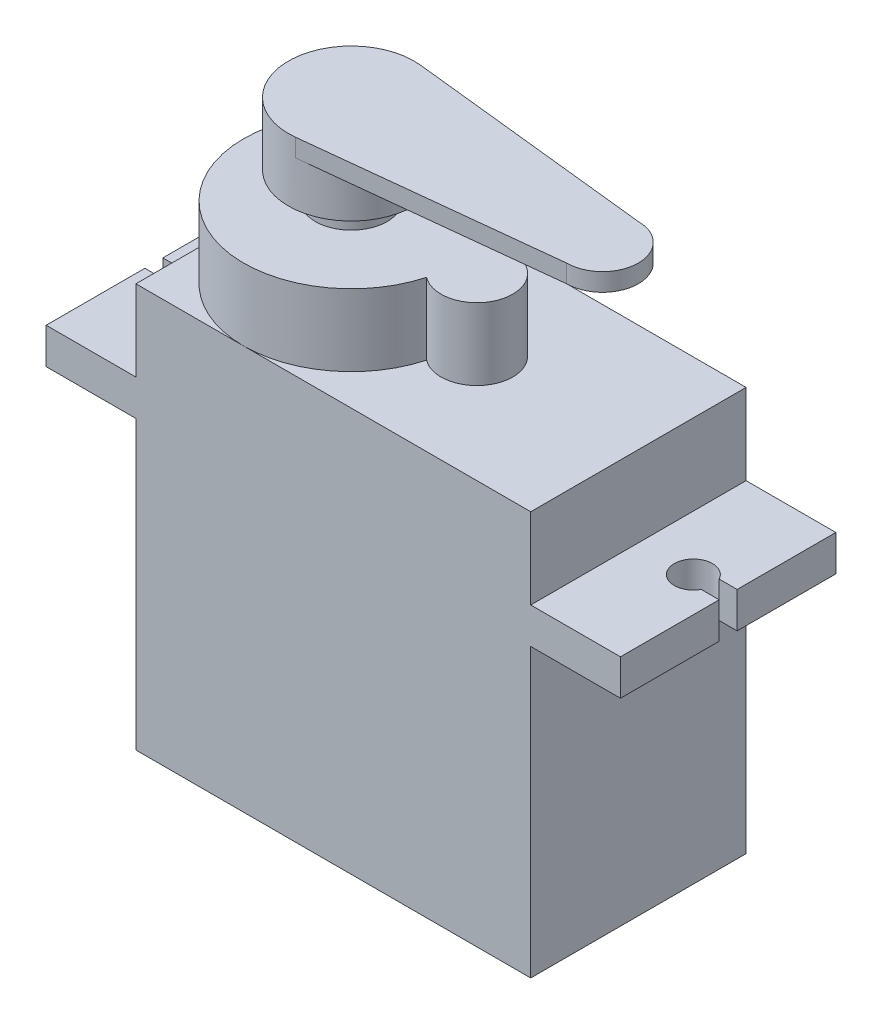
ISO-10303-21;
HEADER;
FILE_DESCRIPTION(('STEP AP214'),'2;1');
FILE_NAME('part.step','',(''),(''),'','','');
FILE_SCHEMA(('AUTOMOTIVE_DESIGN { 1 0 10303 214 1 1 1 1 }'));
ENDSEC;
DATA;
#1=APPLICATION_CONTEXT('core data for automotive mechanical design processes');
#2=APPLICATION_PROTOCOL_DEFINITION('international standard','automotive_design',2000,#1);
#3=PRODUCT_CONTEXT('',#1,'mechanical');
#4=PRODUCT('Part','Part','',(#3));
#5=PRODUCT_RELATED_PRODUCT_CATEGORY('part','',(#4));
#6=PRODUCT_DEFINITION_FORMATION('','',#4);
#7=PRODUCT_DEFINITION_CONTEXT('part definition',#1,'design');
#8=PRODUCT_DEFINITION('design','',#6,#7);
#9=PRODUCT_DEFINITION_SHAPE('','',#8);
#10=(LENGTH_UNIT() NAMED_UNIT(*) SI_UNIT(.MILLI.,.METRE.));
#11=(NAMED_UNIT(*) PLANE_ANGLE_UNIT() SI_UNIT($,.RADIAN.));
#12=(NAMED_UNIT(*) SI_UNIT($,.STERADIAN.) SOLID_ANGLE_UNIT());
#13=UNCERTAINTY_MEASURE_WITH_UNIT(LENGTH_MEASURE(1.E-05),#10,'distance_accuracy_value','');
#14=(GEOMETRIC_REPRESENTATION_CONTEXT(3) GLOBAL_UNCERTAINTY_ASSIGNED_CONTEXT((#13)) GLOBAL_UNIT_ASSIGNED_CONTEXT((#10,
#11,#12)) REPRESENTATION_CONTEXT('',''));
#15=CARTESIAN_POINT('',(0.,0.,0.));
#16=DIRECTION('',(0.,0.,1.));
#17=DIRECTION('',(1.,0.,0.));
#18=AXIS2_PLACEMENT_3D('',#15,#16,#17);
#19=CARTESIAN_POINT('',(-5.,26.5,0.));
#20=DIRECTION('',(0.,-1.,0.));
#21=DIRECTION('',(0.,0.,-1.));
#22=AXIS2_PLACEMENT_3D('',#19,#20,#21);
#23=CYLINDRICAL_SURFACE('',#22,6.);
#24=DIRECTION('',(0.,-1.,0.));
#25=VECTOR('',#24,1.);
#26=CARTESIAN_POINT('',(0.785714285714286,24.5,1.58918539009193));
#27=LINE('',#26,#25);
#28=CARTESIAN_POINT('',(0.785714285714286,26.5,1.58918539009193));
#29=VERTEX_POINT('',#28);
#30=CARTESIAN_POINT('',(0.785714285714285,22.5,1.58918539009193));
#31=VERTEX_POINT('',#30);
#32=EDGE_CURVE('E261',#29,#31,#27,.T.);
#33=ORIENTED_EDGE('',*,*,#32,.F.);
#34=CARTESIAN_POINT('',(-5.,26.5,0.));
#35=DIRECTION('',(0.,1.,0.));
#36=DIRECTION('',(0.,0.,1.));
#37=AXIS2_PLACEMENT_3D('',#34,#35,#36);
#38=CIRCLE('',#37,6.);
#39=CARTESIAN_POINT('',(0.785714285714285,26.5,-1.58918539009193));
#40=VERTEX_POINT('',#39);
#41=EDGE_CURVE('E264',#40,#29,#38,.T.);
#42=ORIENTED_EDGE('',*,*,#41,.F.);
#43=DIRECTION('',(0.,-1.,0.));
#44=VECTOR('',#43,1.);
#45=CARTESIAN_POINT('',(0.785714285714286,24.5,-1.58918539009193));
#46=LINE('',#45,#44);
#47=CARTESIAN_POINT('',(0.785714285714285,22.5,-1.58918539009193));
#48=VERTEX_POINT('',#47);
#49=EDGE_CURVE('E258',#48,#40,#46,.F.);
#50=ORIENTED_EDGE('',*,*,#49,.F.);
#51=CARTESIAN_POINT('',(-5.,22.5,0.));
#52=DIRECTION('',(0.,1.,0.));
#53=DIRECTION('',(0.,0.,1.));
#54=AXIS2_PLACEMENT_3D('',#51,#52,#53);
#55=CIRCLE('',#54,6.);
#56=CARTESIAN_POINT('',(-5.,22.5,-6.));
#57=VERTEX_POINT('',#56);
#58=EDGE_CURVE('E263',#48,#57,#55,.T.);
#59=ORIENTED_EDGE('',*,*,#58,.T.);
#60=CARTESIAN_POINT('',(-11.,22.5,0.));
#61=VERTEX_POINT('',#60);
#62=EDGE_CURVE('E256',#57,#61,#55,.T.);
#63=ORIENTED_EDGE('',*,*,#62,.T.);
#64=CARTESIAN_POINT('',(-5.,22.5,6.));
#65=VERTEX_POINT('',#64);
#66=EDGE_CURVE('E270',#61,#65,#55,.T.);
#67=ORIENTED_EDGE('',*,*,#66,.T.);
#68=EDGE_CURVE('E267',#65,#31,#55,.T.);
#69=ORIENTED_EDGE('',*,*,#68,.T.);
#70=EDGE_LOOP('',(#33,#42,#50,#59,#63,#67,#69));
#71=FACE_BOUND('',#70,.T.);
#72=ADVANCED_FACE('F34',(#71),#23,.T.);
#73=CARTESIAN_POINT('',(0.,22.5,0.));
#74=DIRECTION('',(0.,1.,0.));
#75=DIRECTION('',(0.,0.,1.));
#76=AXIS2_PLACEMENT_3D('',#73,#74,#75);
#77=PLANE('',#76);
#78=ORIENTED_EDGE('',*,*,#58,.F.);
#79=CARTESIAN_POINT('',(2.,22.5,0.));
#80=DIRECTION('',(0.,1.,0.));
#81=DIRECTION('',(0.,0.,1.));
#82=AXIS2_PLACEMENT_3D('',#79,#80,#81);
#83=CIRCLE('',#82,2.);
#84=EDGE_CURVE('E253',#31,#48,#83,.T.);
#85=ORIENTED_EDGE('',*,*,#84,.F.);
#86=ORIENTED_EDGE('',*,*,#68,.F.);
#87=DIRECTION('',(1.,0.,0.));
#88=VECTOR('',#87,1.);
#89=CARTESIAN_POINT('',(-11.,22.5,6.));
#90=LINE('',#89,#88);
#91=CARTESIAN_POINT('',(11.,22.5,6.));
#92=VERTEX_POINT('',#91);
#93=EDGE_CURVE('E393',#65,#92,#90,.T.);
#94=ORIENTED_EDGE('',*,*,#93,.T.);
#95=DIRECTION('',(0.,0.,-1.));
#96=VECTOR('',#95,1.);
#97=CARTESIAN_POINT('',(11.,22.5,-6.));
#98=LINE('',#97,#96);
#99=CARTESIAN_POINT('',(11.,22.5,-6.));
#100=VERTEX_POINT('',#99);
#101=EDGE_CURVE('E381',#92,#100,#98,.T.);
#102=ORIENTED_EDGE('',*,*,#101,.T.);
#103=DIRECTION('',(-1.,0.,0.));
#104=VECTOR('',#103,1.);
#105=CARTESIAN_POINT('',(-11.,22.5,-6.));
#106=LINE('',#105,#104);
#107=EDGE_CURVE('E386',#100,#57,#106,.T.);
#108=ORIENTED_EDGE('',*,*,#107,.T.);
#109=EDGE_LOOP('',(#78,#85,#86,#94,#102,#108));
#110=FACE_BOUND('',#109,.T.);
#111=ADVANCED_FACE('F483',(#110),#77,.T.);
#112=ORIENTED_EDGE('',*,*,#62,.F.);
#113=CARTESIAN_POINT('',(-11.,22.5,-6.));
#114=VERTEX_POINT('',#113);
#115=EDGE_CURVE('E384',#57,#114,#106,.T.);
#116=ORIENTED_EDGE('',*,*,#115,.T.);
#117=DIRECTION('',(0.,0.,1.));
#118=VECTOR('',#117,1.);
#119=CARTESIAN_POINT('',(-11.,22.5,-6.));
#120=LINE('',#119,#118);
#121=EDGE_CURVE('E390',#114,#61,#120,.T.);
#122=ORIENTED_EDGE('',*,*,#121,.T.);
#123=EDGE_LOOP('',(#112,#116,#122));
#124=FACE_BOUND('',#123,.T.);
#125=ADVANCED_FACE('F475',(#124),#77,.T.);
#126=CARTESIAN_POINT('',(16.,16.,6.));
#127=DIRECTION('',(0.,-1.,0.));
#128=DIRECTION('',(0.,0.,-1.));
#129=AXIS2_PLACEMENT_3D('',#126,#127,#128);
#130=PLANE('',#129);
#131=DIRECTION('',(0.,0.,1.));
#132=VECTOR('',#131,1.);
#133=CARTESIAN_POINT('',(16.,16.,6.));
#134=LINE('',#133,#132);
#135=CARTESIAN_POINT('',(16.,16.,-6.));
#136=VERTEX_POINT('',#135);
#137=CARTESIAN_POINT('',(16.,16.,-0.5));
#138=VERTEX_POINT('',#137);
#139=EDGE_CURVE('E302',#136,#138,#134,.T.);
#140=ORIENTED_EDGE('',*,*,#139,.T.);
#141=DIRECTION('',(1.,0.,0.));
#142=VECTOR('',#141,1.);
#143=CARTESIAN_POINT('',(16.,16.,-0.5));
#144=LINE('',#143,#142);
#145=CARTESIAN_POINT('',(15.,16.,-0.5));
#146=VERTEX_POINT('',#145);
#147=EDGE_CURVE('E273',#146,#138,#144,.T.);
#148=ORIENTED_EDGE('',*,*,#147,.F.);
#149=CARTESIAN_POINT('',(14.0625,16.,0.));
#150=DIRECTION('',(0.,-1.,0.));
#151=DIRECTION('',(0.,0.,-1.));
#152=AXIS2_PLACEMENT_3D('',#149,#150,#151);
#153=CIRCLE('',#152,1.0625);
#154=CARTESIAN_POINT('',(15.,16.,0.5));
#155=VERTEX_POINT('',#154);
#156=EDGE_CURVE('E266',#155,#146,#153,.T.);
#157=ORIENTED_EDGE('',*,*,#156,.F.);
#158=DIRECTION('',(-1.,0.,0.));
#159=VECTOR('',#158,1.);
#160=CARTESIAN_POINT('',(16.,16.,0.5));
#161=LINE('',#160,#159);
#162=CARTESIAN_POINT('',(16.,16.,0.5));
#163=VERTEX_POINT('',#162);
#164=EDGE_CURVE('E287',#163,#155,#161,.T.);
#165=ORIENTED_EDGE('',*,*,#164,.F.);
#166=CARTESIAN_POINT('',(16.,16.,6.));
#167=VERTEX_POINT('',#166);
#168=EDGE_CURVE('E300',#163,#167,#134,.T.);
#169=ORIENTED_EDGE('',*,*,#168,.T.);
#170=DIRECTION('',(-1.,0.,0.));
#171=VECTOR('',#170,1.);
#172=CARTESIAN_POINT('',(16.,16.,6.));
#173=LINE('',#172,#171);
#174=CARTESIAN_POINT('',(11.,16.,6.));
#175=VERTEX_POINT('',#174);
#176=EDGE_CURVE('E322',#167,#175,#173,.T.);
#177=ORIENTED_EDGE('',*,*,#176,.T.);
#178=DIRECTION('',(0.,0.,1.));
#179=VECTOR('',#178,1.);
#180=CARTESIAN_POINT('',(11.,16.,6.));
#181=LINE('',#180,#179);
#182=CARTESIAN_POINT('',(11.,16.,-6.));
#183=VERTEX_POINT('',#182);
#184=EDGE_CURVE('E296',#183,#175,#181,.T.);
#185=ORIENTED_EDGE('',*,*,#184,.F.);
#186=DIRECTION('',(-1.,0.,0.));
#187=VECTOR('',#186,1.);
#188=CARTESIAN_POINT('',(16.,16.,-6.));
#189=LINE('',#188,#187);
#190=EDGE_CURVE('E320',#136,#183,#189,.T.);
#191=ORIENTED_EDGE('',*,*,#190,.F.);
#192=EDGE_LOOP('',(#140,#148,#157,#165,#169,#177,#185,#191));
#193=FACE_BOUND('',#192,.T.);
#194=ADVANCED_FACE('F498',(#193),#130,.T.);
#195=CARTESIAN_POINT('',(16.,18.,6.));
#196=DIRECTION('',(0.,1.,0.));
#197=DIRECTION('',(0.,0.,1.));
#198=AXIS2_PLACEMENT_3D('',#195,#196,#197);
#199=PLANE('',#198);
#200=CARTESIAN_POINT('',(14.0625,18.,0.));
#201=DIRECTION('',(0.,-1.,0.));
#202=DIRECTION('',(0.,0.,1.));
#203=AXIS2_PLACEMENT_3D('',#200,#201,#202);
#204=CIRCLE('',#203,1.0625);
#205=CARTESIAN_POINT('',(15.,18.,0.5));
#206=VERTEX_POINT('',#205);
#207=CARTESIAN_POINT('',(15.,18.,-0.5));
#208=VERTEX_POINT('',#207);
#209=EDGE_CURVE('E275',#206,#208,#204,.T.);
#210=ORIENTED_EDGE('',*,*,#209,.T.);
#211=DIRECTION('',(1.,0.,0.));
#212=VECTOR('',#211,1.);
#213=CARTESIAN_POINT('',(16.,18.,-0.5));
#214=LINE('',#213,#212);
#215=CARTESIAN_POINT('',(16.,18.,-0.5));
#216=VERTEX_POINT('',#215);
#217=EDGE_CURVE('E281',#208,#216,#214,.T.);
#218=ORIENTED_EDGE('',*,*,#217,.T.);
#219=DIRECTION('',(0.,0.,-1.));
#220=VECTOR('',#219,1.);
#221=CARTESIAN_POINT('',(16.,18.,6.));
#222=LINE('',#221,#220);
#223=CARTESIAN_POINT('',(16.,18.,-6.));
#224=VERTEX_POINT('',#223);
#225=EDGE_CURVE('E308',#216,#224,#222,.T.);
#226=ORIENTED_EDGE('',*,*,#225,.T.);
#227=DIRECTION('',(-1.,0.,0.));
#228=VECTOR('',#227,1.);
#229=CARTESIAN_POINT('',(16.,18.,-6.));
#230=LINE('',#229,#228);
#231=CARTESIAN_POINT('',(11.,18.,-6.));
#232=VERTEX_POINT('',#231);
#233=EDGE_CURVE('E318',#224,#232,#230,.T.);
#234=ORIENTED_EDGE('',*,*,#233,.T.);
#235=DIRECTION('',(0.,0.,-1.));
#236=VECTOR('',#235,1.);
#237=CARTESIAN_POINT('',(11.,18.,6.));
#238=LINE('',#237,#236);
#239=CARTESIAN_POINT('',(11.,18.,6.));
#240=VERTEX_POINT('',#239);
#241=EDGE_CURVE('E301',#240,#232,#238,.T.);
#242=ORIENTED_EDGE('',*,*,#241,.F.);
#243=DIRECTION('',(-1.,0.,0.));
#244=VECTOR('',#243,1.);
#245=CARTESIAN_POINT('',(16.,18.,6.));
#246=LINE('',#245,#244);
#247=CARTESIAN_POINT('',(16.,18.,6.));
#248=VERTEX_POINT('',#247);
#249=EDGE_CURVE('E312',#248,#240,#246,.T.);
#250=ORIENTED_EDGE('',*,*,#249,.F.);
#251=CARTESIAN_POINT('',(16.,18.,0.5));
#252=VERTEX_POINT('',#251);
#253=EDGE_CURVE('E309',#248,#252,#222,.T.);
#254=ORIENTED_EDGE('',*,*,#253,.T.);
#255=DIRECTION('',(-1.,0.,0.));
#256=VECTOR('',#255,1.);
#257=CARTESIAN_POINT('',(16.,18.,0.5));
#258=LINE('',#257,#256);
#259=EDGE_CURVE('E278',#252,#206,#258,.T.);
#260=ORIENTED_EDGE('',*,*,#259,.T.);
#261=EDGE_LOOP('',(#210,#218,#226,#234,#242,#250,#254,#260));
#262=FACE_BOUND('',#261,.T.);
#263=ADVANCED_FACE('F489',(#262),#199,.T.);
#264=CARTESIAN_POINT('',(16.,0.,0.));
#265=DIRECTION('',(-1.,0.,0.));
#266=DIRECTION('',(0.,0.,-1.));
#267=AXIS2_PLACEMENT_3D('',#264,#265,#266);
#268=PLANE('',#267);
#269=DIRECTION('',(0.,1.,0.));
#270=VECTOR('',#269,1.);
#271=CARTESIAN_POINT('',(16.,-0.001000000000001,-0.5));
#272=LINE('',#271,#270);
#273=EDGE_CURVE('E288',#138,#216,#272,.T.);
#274=ORIENTED_EDGE('',*,*,#273,.F.);
#275=ORIENTED_EDGE('',*,*,#139,.F.);
#276=DIRECTION('',(0.,-1.,0.));
#277=VECTOR('',#276,1.);
#278=CARTESIAN_POINT('',(16.,18.,-6.));
#279=LINE('',#278,#277);
#280=EDGE_CURVE('E305',#224,#136,#279,.T.);
#281=ORIENTED_EDGE('',*,*,#280,.F.);
#282=ORIENTED_EDGE('',*,*,#225,.F.);
#283=EDGE_LOOP('',(#274,#275,#281,#282));
#284=FACE_BOUND('',#283,.T.);
#285=ADVANCED_FACE('F495',(#284),#268,.F.);
#286=DIRECTION('',(0.,1.,0.));
#287=VECTOR('',#286,1.);
#288=CARTESIAN_POINT('',(16.,-0.001000000000001,0.5));
#289=LINE('',#288,#287);
#290=EDGE_CURVE('E290',#163,#252,#289,.T.);
#291=ORIENTED_EDGE('',*,*,#290,.T.);
#292=ORIENTED_EDGE('',*,*,#253,.F.);
#293=DIRECTION('',(0.,1.,0.));
#294=VECTOR('',#293,1.);
#295=CARTESIAN_POINT('',(16.,18.,6.));
#296=LINE('',#295,#294);
#297=EDGE_CURVE('E297',#167,#248,#296,.T.);
#298=ORIENTED_EDGE('',*,*,#297,.F.);
#299=ORIENTED_EDGE('',*,*,#168,.F.);
#300=EDGE_LOOP('',(#291,#292,#298,#299));
#301=FACE_BOUND('',#300,.T.);
#302=ADVANCED_FACE('F505',(#301),#268,.F.);
#303=CARTESIAN_POINT('',(11.,22.5,-6.));
#304=DIRECTION('',(-1.,0.,0.));
#305=DIRECTION('',(0.,0.,1.));
#306=AXIS2_PLACEMENT_3D('',#303,#304,#305);
#307=PLANE('',#306);
#308=DIRECTION('',(0.,-1.,0.));
#309=VECTOR('',#308,1.);
#310=CARTESIAN_POINT('',(11.,22.5,6.));
#311=LINE('',#310,#309);
#312=EDGE_CURVE('E407',#92,#240,#311,.T.);
#313=ORIENTED_EDGE('',*,*,#312,.T.);
#314=ORIENTED_EDGE('',*,*,#241,.T.);
#315=DIRECTION('',(0.,-1.,0.));
#316=VECTOR('',#315,1.);
#317=CARTESIAN_POINT('',(11.,22.5,-6.));
#318=LINE('',#317,#316);
#319=EDGE_CURVE('E417',#100,#232,#318,.T.);
#320=ORIENTED_EDGE('',*,*,#319,.F.);
#321=ORIENTED_EDGE('',*,*,#101,.F.);
#322=EDGE_LOOP('',(#313,#314,#320,#321));
#323=FACE_BOUND('',#322,.T.);
#324=ADVANCED_FACE('F486',(#323),#307,.F.);
#325=CARTESIAN_POINT('',(-16.,0.,0.));
#326=DIRECTION('',(1.,0.,0.));
#327=DIRECTION('',(0.,0.,-1.));
#328=AXIS2_PLACEMENT_3D('',#325,#326,#327);
#329=PLANE('',#328);
#330=DIRECTION('',(0.,0.,-1.));
#331=VECTOR('',#330,1.);
#332=CARTESIAN_POINT('',(-16.,18.,6.));
#333=LINE('',#332,#331);
#334=CARTESIAN_POINT('',(-16.,18.,6.));
#335=VERTEX_POINT('',#334);
#336=CARTESIAN_POINT('',(-16.,18.,0.5));
#337=VERTEX_POINT('',#336);
#338=EDGE_CURVE('E355',#335,#337,#333,.T.);
#339=ORIENTED_EDGE('',*,*,#338,.T.);
#340=DIRECTION('',(0.,1.,0.));
#341=VECTOR('',#340,1.);
#342=CARTESIAN_POINT('',(-16.,-0.001000000000001,0.5));
#343=LINE('',#342,#341);
#344=CARTESIAN_POINT('',(-16.,16.,0.5));
#345=VERTEX_POINT('',#344);
#346=EDGE_CURVE('E341',#345,#337,#343,.T.);
#347=ORIENTED_EDGE('',*,*,#346,.F.);
#348=DIRECTION('',(0.,0.,1.));
#349=VECTOR('',#348,1.);
#350=CARTESIAN_POINT('',(-16.,16.,6.));
#351=LINE('',#350,#349);
#352=CARTESIAN_POINT('',(-16.,16.,6.));
#353=VERTEX_POINT('',#352);
#354=EDGE_CURVE('E360',#345,#353,#351,.T.);
#355=ORIENTED_EDGE('',*,*,#354,.T.);
#356=DIRECTION('',(0.,1.,0.));
#357=VECTOR('',#356,1.);
#358=CARTESIAN_POINT('',(-16.,18.,6.));
#359=LINE('',#358,#357);
#360=EDGE_CURVE('E350',#353,#335,#359,.T.);
#361=ORIENTED_EDGE('',*,*,#360,.T.);
#362=EDGE_LOOP('',(#339,#347,#355,#361));
#363=FACE_BOUND('',#362,.T.);
#364=ADVANCED_FACE('F719',(#363),#329,.F.);
#365=CARTESIAN_POINT('',(-11.,22.5,-6.));
#366=DIRECTION('',(1.,0.,0.));
#367=DIRECTION('',(0.,0.,-1.));
#368=AXIS2_PLACEMENT_3D('',#365,#366,#367);
#369=PLANE('',#368);
#370=DIRECTION('',(0.,0.,1.));
#371=VECTOR('',#370,1.);
#372=CARTESIAN_POINT('',(-11.,16.,6.));
#373=LINE('',#372,#371);
#374=CARTESIAN_POINT('',(-11.,16.,-6.));
#375=VERTEX_POINT('',#374);
#376=CARTESIAN_POINT('',(-11.,16.,6.));
#377=VERTEX_POINT('',#376);
#378=EDGE_CURVE('E354',#375,#377,#373,.T.);
#379=ORIENTED_EDGE('',*,*,#378,.F.);
#380=DIRECTION('',(0.,-1.,0.));
#381=VECTOR('',#380,1.);
#382=CARTESIAN_POINT('',(-11.,22.5,-6.));
#383=LINE('',#382,#381);
#384=CARTESIAN_POINT('',(-11.,0.,-6.));
#385=VERTEX_POINT('',#384);
#386=EDGE_CURVE('E414',#375,#385,#383,.T.);
#387=ORIENTED_EDGE('',*,*,#386,.T.);
#388=DIRECTION('',(0.,0.,1.));
#389=VECTOR('',#388,1.);
#390=CARTESIAN_POINT('',(-11.,0.,-6.));
#391=LINE('',#390,#389);
#392=CARTESIAN_POINT('',(-11.,0.,6.));
#393=VERTEX_POINT('',#392);
#394=EDGE_CURVE('E402',#385,#393,#391,.T.);
#395=ORIENTED_EDGE('',*,*,#394,.T.);
#396=DIRECTION('',(0.,-1.,0.));
#397=VECTOR('',#396,1.);
#398=CARTESIAN_POINT('',(-11.,22.5,6.));
#399=LINE('',#398,#397);
#400=EDGE_CURVE('E410',#377,#393,#399,.T.);
#401=ORIENTED_EDGE('',*,*,#400,.F.);
#402=EDGE_LOOP('',(#379,#387,#395,#401));
#403=FACE_BOUND('',#402,.T.);
#404=ADVANCED_FACE('F441',(#403),#369,.F.);
#405=DIRECTION('',(0.,0.,-1.));
#406=VECTOR('',#405,1.);
#407=CARTESIAN_POINT('',(-11.,18.,6.));
#408=LINE('',#407,#406);
#409=CARTESIAN_POINT('',(-11.,18.,6.));
#410=VERTEX_POINT('',#409);
#411=CARTESIAN_POINT('',(-11.,18.,-6.));
#412=VERTEX_POINT('',#411);
#413=EDGE_CURVE('E349',#410,#412,#408,.T.);
#414=ORIENTED_EDGE('',*,*,#413,.F.);
#415=CARTESIAN_POINT('',(-11.,22.5,6.));
#416=VERTEX_POINT('',#415);
#417=EDGE_CURVE('E411',#416,#410,#399,.T.);
#418=ORIENTED_EDGE('',*,*,#417,.F.);
#419=EDGE_CURVE('E389',#61,#416,#120,.T.);
#420=ORIENTED_EDGE('',*,*,#419,.F.);
#421=ORIENTED_EDGE('',*,*,#121,.F.);
#422=EDGE_CURVE('E415',#114,#412,#383,.T.);
#423=ORIENTED_EDGE('',*,*,#422,.T.);
#424=EDGE_LOOP('',(#414,#418,#420,#421,#423));
#425=FACE_BOUND('',#424,.T.);
#426=ADVANCED_FACE('F464',(#425),#369,.F.);
#427=CARTESIAN_POINT('',(11.,0.,-6.));
#428=VERTEX_POINT('',#427);
#429=EDGE_CURVE('E416',#183,#428,#318,.T.);
#430=ORIENTED_EDGE('',*,*,#429,.F.);
#431=ORIENTED_EDGE('',*,*,#184,.T.);
#432=CARTESIAN_POINT('',(11.,0.,6.));
#433=VERTEX_POINT('',#432);
#434=EDGE_CURVE('E396',#175,#433,#311,.T.);
#435=ORIENTED_EDGE('',*,*,#434,.T.);
#436=DIRECTION('',(0.,0.,-1.));
#437=VECTOR('',#436,1.);
#438=CARTESIAN_POINT('',(11.,0.,-6.));
#439=LINE('',#438,#437);
#440=EDGE_CURVE('E380',#433,#428,#439,.T.);
#441=ORIENTED_EDGE('',*,*,#440,.T.);
#442=EDGE_LOOP('',(#430,#431,#435,#441));
#443=FACE_BOUND('',#442,.T.);
#444=ADVANCED_FACE('F36',(#443),#307,.F.);
#445=CARTESIAN_POINT('',(-11.,22.5,-6.));
#446=DIRECTION('',(0.,0.,1.));
#447=DIRECTION('',(1.,0.,0.));
#448=AXIS2_PLACEMENT_3D('',#445,#446,#447);
#449=PLANE('',#448);
#450=DIRECTION('',(-1.,0.,0.));
#451=VECTOR('',#450,1.);
#452=CARTESIAN_POINT('',(-11.,0.,-6.));
#453=LINE('',#452,#451);
#454=EDGE_CURVE('E399',#428,#385,#453,.T.);
#455=ORIENTED_EDGE('',*,*,#454,.T.);
#456=ORIENTED_EDGE('',*,*,#386,.F.);
#457=DIRECTION('',(1.,0.,0.));
#458=VECTOR('',#457,1.);
#459=CARTESIAN_POINT('',(-16.,16.,-6.));
#460=LINE('',#459,#458);
#461=CARTESIAN_POINT('',(-16.,16.,-6.));
#462=VERTEX_POINT('',#461);
#463=EDGE_CURVE('E371',#462,#375,#460,.T.);
#464=ORIENTED_EDGE('',*,*,#463,.F.);
#465=DIRECTION('',(0.,-1.,0.));
#466=VECTOR('',#465,1.);
#467=CARTESIAN_POINT('',(-16.,18.,-6.));
#468=LINE('',#467,#466);
#469=CARTESIAN_POINT('',(-16.,18.,-6.));
#470=VERTEX_POINT('',#469);
#471=EDGE_CURVE('E358',#470,#462,#468,.T.);
#472=ORIENTED_EDGE('',*,*,#471,.F.);
#473=DIRECTION('',(1.,0.,0.));
#474=VECTOR('',#473,1.);
#475=CARTESIAN_POINT('',(-16.,18.,-6.));
#476=LINE('',#475,#474);
#477=EDGE_CURVE('E374',#470,#412,#476,.T.);
#478=ORIENTED_EDGE('',*,*,#477,.T.);
#479=ORIENTED_EDGE('',*,*,#422,.F.);
#480=ORIENTED_EDGE('',*,*,#115,.F.);
#481=ORIENTED_EDGE('',*,*,#107,.F.);
#482=ORIENTED_EDGE('',*,*,#319,.T.);
#483=ORIENTED_EDGE('',*,*,#233,.F.);
#484=ORIENTED_EDGE('',*,*,#280,.T.);
#485=ORIENTED_EDGE('',*,*,#190,.T.);
#486=ORIENTED_EDGE('',*,*,#429,.T.);
#487=EDGE_LOOP('',(#455,#456,#464,#472,#478,#479,#480,#481,#482,#483,#484,#485,#486));
#488=FACE_BOUND('',#487,.T.);
#489=ADVANCED_FACE('F425',(#488),#449,.F.);
#490=CARTESIAN_POINT('',(-11.,22.5,6.));
#491=DIRECTION('',(0.,0.,-1.));
#492=DIRECTION('',(-1.,0.,0.));
#493=AXIS2_PLACEMENT_3D('',#490,#491,#492);
#494=PLANE('',#493);
#495=DIRECTION('',(1.,0.,0.));
#496=VECTOR('',#495,1.);
#497=CARTESIAN_POINT('',(-11.,0.,6.));
#498=LINE('',#497,#496);
#499=EDGE_CURVE('E385',#393,#433,#498,.T.);
#500=ORIENTED_EDGE('',*,*,#499,.T.);
#501=ORIENTED_EDGE('',*,*,#434,.F.);
#502=ORIENTED_EDGE('',*,*,#176,.F.);
#503=ORIENTED_EDGE('',*,*,#297,.T.);
#504=ORIENTED_EDGE('',*,*,#249,.T.);
#505=ORIENTED_EDGE('',*,*,#312,.F.);
#506=ORIENTED_EDGE('',*,*,#93,.F.);
#507=EDGE_CURVE('E394',#416,#65,#90,.T.);
#508=ORIENTED_EDGE('',*,*,#507,.F.);
#509=ORIENTED_EDGE('',*,*,#417,.T.);
#510=DIRECTION('',(1.,0.,0.));
#511=VECTOR('',#510,1.);
#512=CARTESIAN_POINT('',(-16.,18.,6.));
#513=LINE('',#512,#511);
#514=EDGE_CURVE('E377',#335,#410,#513,.T.);
#515=ORIENTED_EDGE('',*,*,#514,.F.);
#516=ORIENTED_EDGE('',*,*,#360,.F.);
#517=DIRECTION('',(1.,0.,0.));
#518=VECTOR('',#517,1.);
#519=CARTESIAN_POINT('',(-16.,16.,6.));
#520=LINE('',#519,#518);
#521=EDGE_CURVE('E364',#353,#377,#520,.T.);
#522=ORIENTED_EDGE('',*,*,#521,.T.);
#523=ORIENTED_EDGE('',*,*,#400,.T.);
#524=EDGE_LOOP('',(#500,#501,#502,#503,#504,#505,#506,#508,#509,#515,#516,#522,#523));
#525=FACE_BOUND('',#524,.T.);
#526=ADVANCED_FACE('F437',(#525),#494,.F.);
#527=ORIENTED_EDGE('',*,*,#66,.F.);
#528=ORIENTED_EDGE('',*,*,#419,.T.);
#529=ORIENTED_EDGE('',*,*,#507,.T.);
#530=EDGE_LOOP('',(#527,#528,#529));
#531=FACE_BOUND('',#530,.T.);
#532=ADVANCED_FACE('F471',(#531),#77,.T.);
#533=CARTESIAN_POINT('',(0.,0.,0.));
#534=DIRECTION('',(0.,1.,0.));
#535=DIRECTION('',(0.,0.,1.));
#536=AXIS2_PLACEMENT_3D('',#533,#534,#535);
#537=PLANE('',#536);
#538=ORIENTED_EDGE('',*,*,#440,.F.);
#539=ORIENTED_EDGE('',*,*,#499,.F.);
#540=ORIENTED_EDGE('',*,*,#394,.F.);
#541=ORIENTED_EDGE('',*,*,#454,.F.);
#542=EDGE_LOOP('',(#538,#539,#540,#541));
#543=FACE_BOUND('',#542,.T.);
#544=ADVANCED_FACE('F432',(#543),#537,.F.);
#545=CARTESIAN_POINT('',(-16.,18.,6.));
#546=DIRECTION('',(0.,-1.,0.));
#547=DIRECTION('',(0.,0.,-1.));
#548=AXIS2_PLACEMENT_3D('',#545,#546,#547);
#549=PLANE('',#548);
#550=CARTESIAN_POINT('',(-14.0625,18.,0.));
#551=DIRECTION('',(0.,1.,0.));
#552=DIRECTION('',(0.,0.,1.));
#553=AXIS2_PLACEMENT_3D('',#550,#551,#552);
#554=CIRCLE('',#553,1.0625);
#555=CARTESIAN_POINT('',(-15.,18.,0.5));
#556=VERTEX_POINT('',#555);
#557=CARTESIAN_POINT('',(-15.,18.,-0.5));
#558=VERTEX_POINT('',#557);
#559=EDGE_CURVE('E329',#556,#558,#554,.T.);
#560=ORIENTED_EDGE('',*,*,#559,.F.);
#561=DIRECTION('',(1.,0.,0.));
#562=VECTOR('',#561,1.);
#563=CARTESIAN_POINT('',(-16.,18.,0.5));
#564=LINE('',#563,#562);
#565=EDGE_CURVE('E334',#337,#556,#564,.T.);
#566=ORIENTED_EDGE('',*,*,#565,.F.);
#567=ORIENTED_EDGE('',*,*,#338,.F.);
#568=ORIENTED_EDGE('',*,*,#514,.T.);
#569=ORIENTED_EDGE('',*,*,#413,.T.);
#570=ORIENTED_EDGE('',*,*,#477,.F.);
#571=CARTESIAN_POINT('',(-16.,18.,-0.5));
#572=VERTEX_POINT('',#571);
#573=EDGE_CURVE('E353',#572,#470,#333,.T.);
#574=ORIENTED_EDGE('',*,*,#573,.F.);
#575=DIRECTION('',(-1.,0.,0.));
#576=VECTOR('',#575,1.);
#577=CARTESIAN_POINT('',(-16.,18.,-0.5));
#578=LINE('',#577,#576);
#579=EDGE_CURVE('E332',#558,#572,#578,.T.);
#580=ORIENTED_EDGE('',*,*,#579,.F.);
#581=EDGE_LOOP('',(#560,#566,#567,#568,#569,#570,#574,#580));
#582=FACE_BOUND('',#581,.T.);
#583=ADVANCED_FACE('F459',(#582),#549,.F.);
#584=CARTESIAN_POINT('',(-16.,16.,6.));
#585=DIRECTION('',(0.,1.,0.));
#586=DIRECTION('',(0.,0.,1.));
#587=AXIS2_PLACEMENT_3D('',#584,#585,#586);
#588=PLANE('',#587);
#589=ORIENTED_EDGE('',*,*,#354,.F.);
#590=DIRECTION('',(-1.,0.,0.));
#591=VECTOR('',#590,1.);
#592=CARTESIAN_POINT('',(-16.,16.,0.5));
#593=LINE('',#592,#591);
#594=CARTESIAN_POINT('',(-15.,16.,0.5));
#595=VERTEX_POINT('',#594);
#596=EDGE_CURVE('E327',#595,#345,#593,.T.);
#597=ORIENTED_EDGE('',*,*,#596,.F.);
#598=CARTESIAN_POINT('',(-14.0625,16.,0.));
#599=DIRECTION('',(0.,1.,0.));
#600=DIRECTION('',(0.,0.,1.));
#601=AXIS2_PLACEMENT_3D('',#598,#599,#600);
#602=CIRCLE('',#601,1.0625);
#603=CARTESIAN_POINT('',(-15.,16.,-0.5));
#604=VERTEX_POINT('',#603);
#605=EDGE_CURVE('E324',#604,#595,#602,.F.);
#606=ORIENTED_EDGE('',*,*,#605,.F.);
#607=DIRECTION('',(1.,0.,0.));
#608=VECTOR('',#607,1.);
#609=CARTESIAN_POINT('',(-16.,16.,-0.5));
#610=LINE('',#609,#608);
#611=CARTESIAN_POINT('',(-16.,16.,-0.5));
#612=VERTEX_POINT('',#611);
#613=EDGE_CURVE('E340',#612,#604,#610,.T.);
#614=ORIENTED_EDGE('',*,*,#613,.F.);
#615=EDGE_CURVE('E361',#462,#612,#351,.T.);
#616=ORIENTED_EDGE('',*,*,#615,.F.);
#617=ORIENTED_EDGE('',*,*,#463,.T.);
#618=ORIENTED_EDGE('',*,*,#378,.T.);
#619=ORIENTED_EDGE('',*,*,#521,.F.);
#620=EDGE_LOOP('',(#589,#597,#606,#614,#616,#617,#618,#619));
#621=FACE_BOUND('',#620,.T.);
#622=ADVANCED_FACE('F447',(#621),#588,.F.);
#623=ORIENTED_EDGE('',*,*,#615,.T.);
#624=DIRECTION('',(0.,1.,0.));
#625=VECTOR('',#624,1.);
#626=CARTESIAN_POINT('',(-16.,-0.001000000000001,-0.5));
#627=LINE('',#626,#625);
#628=EDGE_CURVE('E343',#612,#572,#627,.T.);
#629=ORIENTED_EDGE('',*,*,#628,.T.);
#630=ORIENTED_EDGE('',*,*,#573,.T.);
#631=ORIENTED_EDGE('',*,*,#471,.T.);
#632=EDGE_LOOP('',(#623,#629,#630,#631));
#633=FACE_BOUND('',#632,.T.);
#634=ADVANCED_FACE('F451',(#633),#329,.F.);
#635=CARTESIAN_POINT('',(-14.0625,-0.001000000000001,0.));
#636=DIRECTION('',(0.,1.,0.));
#637=DIRECTION('',(0.,0.,1.));
#638=AXIS2_PLACEMENT_3D('',#635,#636,#637);
#639=CYLINDRICAL_SURFACE('',#638,1.0625);
#640=ORIENTED_EDGE('',*,*,#605,.T.);
#641=DIRECTION('',(0.,1.,0.));
#642=VECTOR('',#641,1.);
#643=CARTESIAN_POINT('',(-15.,-0.001000000000001,0.5));
#644=LINE('',#643,#642);
#645=EDGE_CURVE('E338',#595,#556,#644,.T.);
#646=ORIENTED_EDGE('',*,*,#645,.T.);
#647=ORIENTED_EDGE('',*,*,#559,.T.);
#648=DIRECTION('',(0.,1.,0.));
#649=VECTOR('',#648,1.);
#650=CARTESIAN_POINT('',(-15.,-0.001000000000001,-0.5));
#651=LINE('',#650,#649);
#652=EDGE_CURVE('E337',#604,#558,#651,.T.);
#653=ORIENTED_EDGE('',*,*,#652,.F.);
#654=EDGE_LOOP('',(#640,#646,#647,#653));
#655=FACE_BOUND('',#654,.T.);
#656=ADVANCED_FACE('F717',(#655),#639,.F.);
#657=CARTESIAN_POINT('',(-16.,-0.001000000000001,0.5));
#658=DIRECTION('',(0.,0.,1.));
#659=DIRECTION('',(1.,0.,0.));
#660=AXIS2_PLACEMENT_3D('',#657,#658,#659);
#661=PLANE('',#660);
#662=ORIENTED_EDGE('',*,*,#596,.T.);
#663=ORIENTED_EDGE('',*,*,#346,.T.);
#664=ORIENTED_EDGE('',*,*,#565,.T.);
#665=ORIENTED_EDGE('',*,*,#645,.F.);
#666=EDGE_LOOP('',(#662,#663,#664,#665));
#667=FACE_BOUND('',#666,.T.);
#668=ADVANCED_FACE('F725',(#667),#661,.F.);
#669=CARTESIAN_POINT('',(-16.,-0.001000000000001,-0.5));
#670=DIRECTION('',(0.,0.,-1.));
#671=DIRECTION('',(-1.,0.,0.));
#672=AXIS2_PLACEMENT_3D('',#669,#670,#671);
#673=PLANE('',#672);
#674=ORIENTED_EDGE('',*,*,#613,.T.);
#675=ORIENTED_EDGE('',*,*,#652,.T.);
#676=ORIENTED_EDGE('',*,*,#579,.T.);
#677=ORIENTED_EDGE('',*,*,#628,.F.);
#678=EDGE_LOOP('',(#674,#675,#676,#677));
#679=FACE_BOUND('',#678,.T.);
#680=ADVANCED_FACE('F522',(#679),#673,.F.);
#681=CARTESIAN_POINT('',(14.0625,-0.001000000000001,0.));
#682=DIRECTION('',(0.,1.,0.));
#683=DIRECTION('',(0.,0.,1.));
#684=AXIS2_PLACEMENT_3D('',#681,#682,#683);
#685=CYLINDRICAL_SURFACE('',#684,1.0625);
#686=ORIENTED_EDGE('',*,*,#156,.T.);
#687=DIRECTION('',(0.,1.,0.));
#688=VECTOR('',#687,1.);
#689=CARTESIAN_POINT('',(15.,-0.001000000000001,-0.5));
#690=LINE('',#689,#688);
#691=EDGE_CURVE('E285',#146,#208,#690,.T.);
#692=ORIENTED_EDGE('',*,*,#691,.T.);
#693=ORIENTED_EDGE('',*,*,#209,.F.);
#694=DIRECTION('',(0.,1.,0.));
#695=VECTOR('',#694,1.);
#696=CARTESIAN_POINT('',(15.,-0.001000000000001,0.5));
#697=LINE('',#696,#695);
#698=EDGE_CURVE('E284',#155,#206,#697,.T.);
#699=ORIENTED_EDGE('',*,*,#698,.F.);
#700=EDGE_LOOP('',(#686,#692,#693,#699));
#701=FACE_BOUND('',#700,.T.);
#702=ADVANCED_FACE('F510',(#701),#685,.F.);
#703=CARTESIAN_POINT('',(16.,-0.001000000000001,-0.5));
#704=DIRECTION('',(0.,0.,1.));
#705=DIRECTION('',(1.,0.,0.));
#706=AXIS2_PLACEMENT_3D('',#703,#704,#705);
#707=PLANE('',#706);
#708=ORIENTED_EDGE('',*,*,#147,.T.);
#709=ORIENTED_EDGE('',*,*,#273,.T.);
#710=ORIENTED_EDGE('',*,*,#217,.F.);
#711=ORIENTED_EDGE('',*,*,#691,.F.);
#712=EDGE_LOOP('',(#708,#709,#710,#711));
#713=FACE_BOUND('',#712,.T.);
#714=ADVANCED_FACE('F513',(#713),#707,.T.);
#715=CARTESIAN_POINT('',(16.,-0.001000000000001,0.5));
#716=DIRECTION('',(0.,0.,-1.));
#717=DIRECTION('',(-1.,0.,0.));
#718=AXIS2_PLACEMENT_3D('',#715,#716,#717);
#719=PLANE('',#718);
#720=ORIENTED_EDGE('',*,*,#164,.T.);
#721=ORIENTED_EDGE('',*,*,#698,.T.);
#722=ORIENTED_EDGE('',*,*,#259,.F.);
#723=ORIENTED_EDGE('',*,*,#290,.F.);
#724=EDGE_LOOP('',(#720,#721,#722,#723));
#725=FACE_BOUND('',#724,.T.);
#726=ADVANCED_FACE('F508',(#725),#719,.T.);
#727=CARTESIAN_POINT('',(-5.,26.5,0.));
#728=DIRECTION('',(0.,1.,0.));
#729=DIRECTION('',(0.,0.,1.));
#730=AXIS2_PLACEMENT_3D('',#727,#728,#729);
#731=PLANE('',#730);
#732=CARTESIAN_POINT('',(-5.,26.5,0.));
#733=DIRECTION('',(0.,1.,0.));
#734=DIRECTION('',(0.,0.,1.));
#735=AXIS2_PLACEMENT_3D('',#732,#733,#734);
#736=CIRCLE('',#735,2.);
#737=CARTESIAN_POINT('',(-5.,26.5,2.));
#738=VERTEX_POINT('',#737);
#739=EDGE_CURVE('E42',#738,#738,#736,.T.);
#740=ORIENTED_EDGE('',*,*,#739,.F.);
#741=EDGE_LOOP('',(#740));
#742=FACE_BOUND('',#741,.T.);
#743=ORIENTED_EDGE('',*,*,#41,.T.);
#744=CARTESIAN_POINT('',(2.,26.5,0.));
#745=DIRECTION('',(0.,1.,0.));
#746=DIRECTION('',(0.,0.,1.));
#747=AXIS2_PLACEMENT_3D('',#744,#745,#746);
#748=CIRCLE('',#747,2.);
#749=EDGE_CURVE('E56',#29,#40,#748,.T.);
#750=ORIENTED_EDGE('',*,*,#749,.T.);
#751=EDGE_LOOP('',(#743,#750));
#752=FACE_BOUND('',#751,.T.);
#753=ADVANCED_FACE('F520',(#742,#752),#731,.T.);
#754=CARTESIAN_POINT('',(2.,26.5,0.));
#755=DIRECTION('',(0.,-1.,0.));
#756=DIRECTION('',(0.,0.,-1.));
#757=AXIS2_PLACEMENT_3D('',#754,#755,#756);
#758=CYLINDRICAL_SURFACE('',#757,2.);
#759=ORIENTED_EDGE('',*,*,#749,.F.);
#760=ORIENTED_EDGE('',*,*,#32,.T.);
#761=ORIENTED_EDGE('',*,*,#84,.T.);
#762=ORIENTED_EDGE('',*,*,#49,.T.);
#763=EDGE_LOOP('',(#759,#760,#761,#762));
#764=FACE_BOUND('',#763,.T.);
#765=ADVANCED_FACE('F533',(#764),#758,.T.);
#766=CARTESIAN_POINT('',(-5.,28.,0.));
#767=DIRECTION('',(0.,-1.,0.));
#768=DIRECTION('',(0.,0.,-1.));
#769=AXIS2_PLACEMENT_3D('',#766,#767,#768);
#770=CYLINDRICAL_SURFACE('',#769,2.);
#771=CARTESIAN_POINT('',(-5.,28.,0.));
#772=DIRECTION('',(0.,1.,0.));
#773=DIRECTION('',(0.,0.,1.));
#774=AXIS2_PLACEMENT_3D('',#771,#772,#773);
#775=CIRCLE('',#774,2.);
#776=CARTESIAN_POINT('',(-5.,28.,2.));
#777=VERTEX_POINT('',#776);
#778=EDGE_CURVE('E247',#777,#777,#775,.T.);
#779=ORIENTED_EDGE('',*,*,#778,.F.);
#780=EDGE_LOOP('',(#779));
#781=FACE_BOUND('',#780,.T.);
#782=ORIENTED_EDGE('',*,*,#739,.T.);
#783=EDGE_LOOP('',(#782));
#784=FACE_BOUND('',#783,.T.);
#785=ADVANCED_FACE('F537',(#781,#784),#770,.T.);
#786=CARTESIAN_POINT('',(-5.,31.5,0.));
#787=DIRECTION('',(0.,-1.,0.));
#788=DIRECTION('',(0.,0.,-1.));
#789=AXIS2_PLACEMENT_3D('',#786,#787,#788);
#790=CYLINDRICAL_SURFACE('',#789,3.5);
#791=CARTESIAN_POINT('',(-5.,31.5,0.));
#792=DIRECTION('',(0.,1.,0.));
#793=DIRECTION('',(0.,0.,1.));
#794=AXIS2_PLACEMENT_3D('',#791,#792,#793);
#795=CIRCLE('',#794,3.5);
#796=CARTESIAN_POINT('',(-4.62207663621157,31.5,-3.47953645348096));
#797=VERTEX_POINT('',#796);
#798=CARTESIAN_POINT('',(-4.62207663621157,31.5,3.47953645348096));
#799=VERTEX_POINT('',#798);
#800=EDGE_CURVE('E237',#797,#799,#795,.T.);
#801=ORIENTED_EDGE('',*,*,#800,.F.);
#802=DIRECTION('',(0.,1.,0.));
#803=VECTOR('',#802,1.);
#804=CARTESIAN_POINT('',(-4.62207663621157,30.5,-3.47953645348096));
#805=LINE('',#804,#803);
#806=CARTESIAN_POINT('',(-4.62207663621157,30.5,-3.47953645348096));
#807=VERTEX_POINT('',#806);
#808=EDGE_CURVE('E230',#807,#797,#805,.T.);
#809=ORIENTED_EDGE('',*,*,#808,.F.);
#810=CARTESIAN_POINT('',(-5.,30.5,0.));
#811=DIRECTION('',(0.,1.,0.));
#812=DIRECTION('',(0.,0.,1.));
#813=AXIS2_PLACEMENT_3D('',#810,#811,#812);
#814=CIRCLE('',#813,3.5);
#815=CARTESIAN_POINT('',(-4.62207663621157,30.5,3.47953645348096));
#816=VERTEX_POINT('',#815);
#817=EDGE_CURVE('E11',#816,#807,#814,.T.);
#818=ORIENTED_EDGE('',*,*,#817,.F.);
#819=DIRECTION('',(0.,1.,0.));
#820=VECTOR('',#819,1.);
#821=CARTESIAN_POINT('',(-4.62207663621157,30.5,3.47953645348096));
#822=LINE('',#821,#820);
#823=EDGE_CURVE('E238',#816,#799,#822,.T.);
#824=ORIENTED_EDGE('',*,*,#823,.T.);
#825=EDGE_LOOP('',(#801,#809,#818,#824));
#826=FACE_BOUND('',#825,.T.);
#827=CARTESIAN_POINT('',(-5.,28.,0.));
#828=DIRECTION('',(0.,1.,0.));
#829=DIRECTION('',(0.,0.,1.));
#830=AXIS2_PLACEMENT_3D('',#827,#828,#829);
#831=CIRCLE('',#830,3.5);
#832=CARTESIAN_POINT('',(-5.,28.,3.5));
#833=VERTEX_POINT('',#832);
#834=EDGE_CURVE('E248',#833,#833,#831,.T.);
#835=ORIENTED_EDGE('',*,*,#834,.T.);
#836=EDGE_LOOP('',(#835));
#837=FACE_BOUND('',#836,.T.);
#838=ADVANCED_FACE('F235',(#826,#837),#790,.T.);
#839=CARTESIAN_POINT('',(-5.,31.5,0.));
#840=DIRECTION('',(0.,1.,0.));
#841=DIRECTION('',(0.,0.,1.));
#842=AXIS2_PLACEMENT_3D('',#839,#840,#841);
#843=PLANE('',#842);
#844=ORIENTED_EDGE('',*,*,#800,.T.);
#845=DIRECTION('',(0.994153272423131,0.,-0.107978103939553));
#846=VECTOR('',#845,1.);
#847=CARTESIAN_POINT('',(-4.62207663621157,31.5,3.47953645348096));
#848=LINE('',#847,#846);
#849=CARTESIAN_POINT('',(9.,31.5,2.));
#850=VERTEX_POINT('',#849);
#851=EDGE_CURVE('E830',#799,#850,#848,.T.);
#852=ORIENTED_EDGE('',*,*,#851,.T.);
#853=CARTESIAN_POINT('',(9.,31.5,0.));
#854=DIRECTION('',(0.,1.,0.));
#855=DIRECTION('',(0.,0.,1.));
#856=AXIS2_PLACEMENT_3D('',#853,#854,#855);
#857=CIRCLE('',#856,2.);
#858=CARTESIAN_POINT('',(9.,31.5,-2.));
#859=VERTEX_POINT('',#858);
#860=EDGE_CURVE('E233',#850,#859,#857,.T.);
#861=ORIENTED_EDGE('',*,*,#860,.T.);
#862=DIRECTION('',(-0.994153272423131,0.,-0.107978103939553));
#863=VECTOR('',#862,1.);
#864=CARTESIAN_POINT('',(-4.62207663621157,31.5,-3.47953645348096));
#865=LINE('',#864,#863);
#866=EDGE_CURVE('E49',#859,#797,#865,.T.);
#867=ORIENTED_EDGE('',*,*,#866,.T.);
#868=EDGE_LOOP('',(#844,#852,#861,#867));
#869=FACE_BOUND('',#868,.T.);
#870=ADVANCED_FACE('F544',(#869),#843,.T.);
#871=CARTESIAN_POINT('',(-5.,28.,0.));
#872=DIRECTION('',(0.,1.,0.));
#873=DIRECTION('',(0.,0.,1.));
#874=AXIS2_PLACEMENT_3D('',#871,#872,#873);
#875=PLANE('',#874);
#876=ORIENTED_EDGE('',*,*,#778,.T.);
#877=EDGE_LOOP('',(#876));
#878=FACE_BOUND('',#877,.T.);
#879=ORIENTED_EDGE('',*,*,#834,.F.);
#880=EDGE_LOOP('',(#879));
#881=FACE_BOUND('',#880,.T.);
#882=ADVANCED_FACE('F545',(#878,#881),#875,.F.);
#883=CARTESIAN_POINT('',(-4.62207663621157,30.5,-3.47953645348096));
#884=DIRECTION('',(0.107978103939553,0.,-0.99415327242313));
#885=DIRECTION('',(-0.994153272423131,0.,-0.107978103939553));
#886=AXIS2_PLACEMENT_3D('',#883,#884,#885);
#887=PLANE('',#886);
#888=ORIENTED_EDGE('',*,*,#866,.F.);
#889=DIRECTION('',(0.,1.,0.));
#890=VECTOR('',#889,1.);
#891=CARTESIAN_POINT('',(9.,30.5,-2.));
#892=LINE('',#891,#890);
#893=CARTESIAN_POINT('',(9.,30.5,-2.));
#894=VERTEX_POINT('',#893);
#895=EDGE_CURVE('E232',#894,#859,#892,.T.);
#896=ORIENTED_EDGE('',*,*,#895,.F.);
#897=DIRECTION('',(-0.994153272423131,0.,-0.107978103939553));
#898=VECTOR('',#897,1.);
#899=CARTESIAN_POINT('',(-4.62207663621157,30.5,-3.47953645348096));
#900=LINE('',#899,#898);
#901=EDGE_CURVE('E221',#894,#807,#900,.T.);
#902=ORIENTED_EDGE('',*,*,#901,.T.);
#903=ORIENTED_EDGE('',*,*,#808,.T.);
#904=EDGE_LOOP('',(#888,#896,#902,#903));
#905=FACE_BOUND('',#904,.T.);
#906=ADVANCED_FACE('F229',(#905),#887,.T.);
#907=CARTESIAN_POINT('',(9.,30.5,0.));
#908=DIRECTION('',(0.,1.,0.));
#909=DIRECTION('',(0.,0.,1.));
#910=AXIS2_PLACEMENT_3D('',#907,#908,#909);
#911=CYLINDRICAL_SURFACE('',#910,2.);
#912=ORIENTED_EDGE('',*,*,#860,.F.);
#913=DIRECTION('',(0.,1.,0.));
#914=VECTOR('',#913,1.);
#915=CARTESIAN_POINT('',(9.,30.5,2.));
#916=LINE('',#915,#914);
#917=CARTESIAN_POINT('',(9.,30.5,2.));
#918=VERTEX_POINT('',#917);
#919=EDGE_CURVE('E241',#918,#850,#916,.T.);
#920=ORIENTED_EDGE('',*,*,#919,.F.);
#921=CARTESIAN_POINT('',(9.,30.5,0.));
#922=DIRECTION('',(0.,1.,0.));
#923=DIRECTION('',(0.,0.,1.));
#924=AXIS2_PLACEMENT_3D('',#921,#922,#923);
#925=CIRCLE('',#924,2.);
#926=EDGE_CURVE('E239',#918,#894,#925,.T.);
#927=ORIENTED_EDGE('',*,*,#926,.T.);
#928=ORIENTED_EDGE('',*,*,#895,.T.);
#929=EDGE_LOOP('',(#912,#920,#927,#928));
#930=FACE_BOUND('',#929,.T.);
#931=ADVANCED_FACE('F553',(#930),#911,.T.);
#932=CARTESIAN_POINT('',(-4.62207663621157,30.5,3.47953645348096));
#933=DIRECTION('',(0.107978103939553,0.,0.99415327242313));
#934=DIRECTION('',(0.994153272423131,0.,-0.107978103939553));
#935=AXIS2_PLACEMENT_3D('',#932,#933,#934);
#936=PLANE('',#935);
#937=ORIENTED_EDGE('',*,*,#851,.F.);
#938=ORIENTED_EDGE('',*,*,#823,.F.);
#939=DIRECTION('',(0.994153272423131,0.,-0.107978103939553));
#940=VECTOR('',#939,1.);
#941=CARTESIAN_POINT('',(-4.62207663621157,30.5,3.47953645348096));
#942=LINE('',#941,#940);
#943=EDGE_CURVE('E224',#816,#918,#942,.T.);
#944=ORIENTED_EDGE('',*,*,#943,.T.);
#945=ORIENTED_EDGE('',*,*,#919,.T.);
#946=EDGE_LOOP('',(#937,#938,#944,#945));
#947=FACE_BOUND('',#946,.T.);
#948=ADVANCED_FACE('F554',(#947),#936,.T.);
#949=CARTESIAN_POINT('',(9.,30.5,0.));
#950=DIRECTION('',(0.,1.,0.));
#951=DIRECTION('',(0.,0.,1.));
#952=AXIS2_PLACEMENT_3D('',#949,#950,#951);
#953=PLANE('',#952);
#954=ORIENTED_EDGE('',*,*,#943,.F.);
#955=ORIENTED_EDGE('',*,*,#817,.T.);
#956=ORIENTED_EDGE('',*,*,#901,.F.);
#957=ORIENTED_EDGE('',*,*,#926,.F.);
#958=EDGE_LOOP('',(#954,#955,#956,#957));
#959=FACE_BOUND('',#958,.T.);
#960=ADVANCED_FACE('F219',(#959),#953,.F.);
#961=CLOSED_SHELL('',(#72,#111,#125,#194,#263,#285,#302,#324,#364,#404,#426,#444,#489,#526,#532,
#544,#583,#622,#634,#656,#668,#680,#702,#714,#726,#753,#765,#785,#838,#870,#882,#906,#931,#948,#960));
#962=MANIFOLD_SOLID_BREP('B2',#961);
#963=ADVANCED_BREP_SHAPE_REPRESENTATION('',(#18,#962),#14);
#964=SHAPE_DEFINITION_REPRESENTATION(#9,#963);
ENDSEC;
END-ISO-10303-21;
